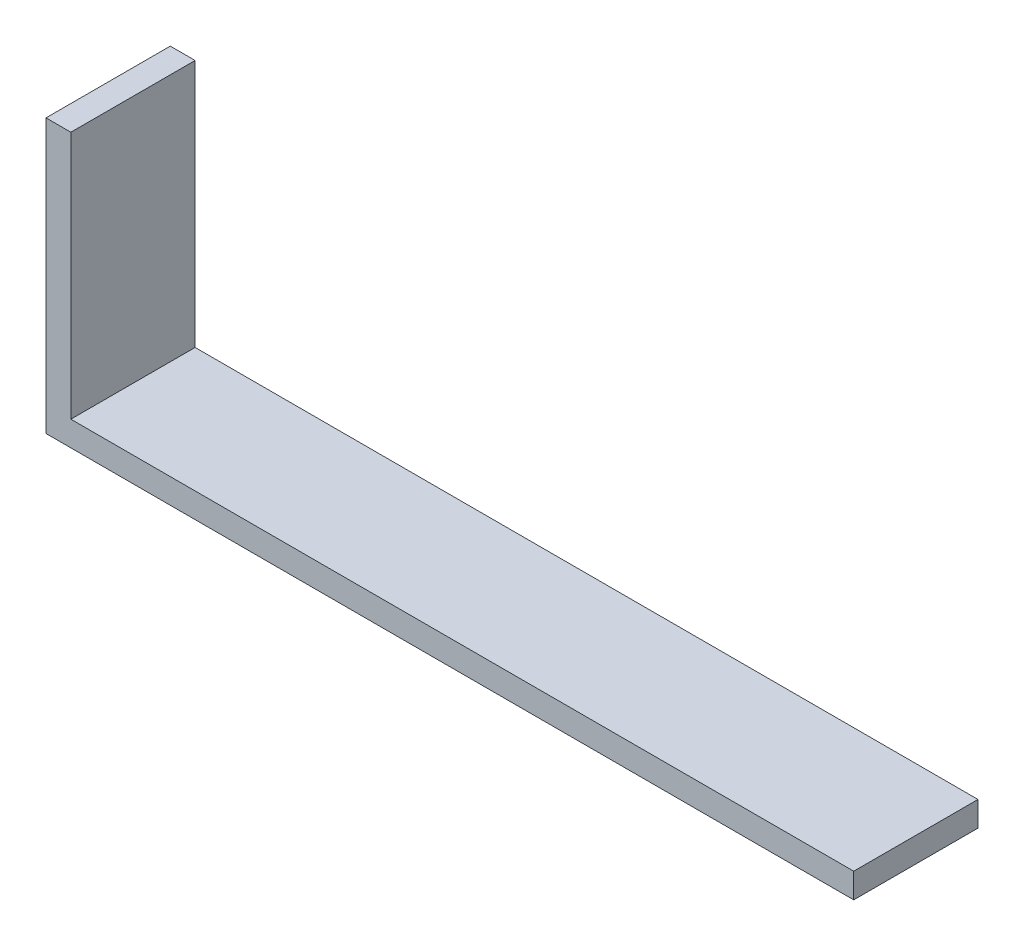
ISO-10303-21;
HEADER;
FILE_DESCRIPTION(('STEP AP214'),'2;1');
FILE_NAME('part.step','',(''),(''),'','','');
FILE_SCHEMA(('AUTOMOTIVE_DESIGN { 1 0 10303 214 1 1 1 1 }'));
ENDSEC;
DATA;
#1=APPLICATION_CONTEXT('core data for automotive mechanical design processes');
#2=APPLICATION_PROTOCOL_DEFINITION('international standard','automotive_design',2000,#1);
#3=PRODUCT_CONTEXT('',#1,'mechanical');
#4=PRODUCT('Part','Part','',(#3));
#5=PRODUCT_RELATED_PRODUCT_CATEGORY('part','',(#4));
#6=PRODUCT_DEFINITION_FORMATION('','',#4);
#7=PRODUCT_DEFINITION_CONTEXT('part definition',#1,'design');
#8=PRODUCT_DEFINITION('design','',#6,#7);
#9=PRODUCT_DEFINITION_SHAPE('','',#8);
#10=(LENGTH_UNIT() NAMED_UNIT(*) SI_UNIT(.MILLI.,.METRE.));
#11=(NAMED_UNIT(*) PLANE_ANGLE_UNIT() SI_UNIT($,.RADIAN.));
#12=(NAMED_UNIT(*) SI_UNIT($,.STERADIAN.) SOLID_ANGLE_UNIT());
#13=UNCERTAINTY_MEASURE_WITH_UNIT(LENGTH_MEASURE(1.E-05),#10,'distance_accuracy_value','');
#14=(GEOMETRIC_REPRESENTATION_CONTEXT(3) GLOBAL_UNCERTAINTY_ASSIGNED_CONTEXT((#13)) GLOBAL_UNIT_ASSIGNED_CONTEXT((#10,
#11,#12)) REPRESENTATION_CONTEXT('',''));
#15=CARTESIAN_POINT('',(0.,0.,0.));
#16=DIRECTION('',(0.,0.,1.));
#17=DIRECTION('',(1.,0.,0.));
#18=AXIS2_PLACEMENT_3D('',#15,#16,#17);
#19=CARTESIAN_POINT('',(1.27,5.98129032258065,6.35));
#20=DIRECTION('',(0.,-1.,0.));
#21=DIRECTION('',(0.,0.,-1.));
#22=AXIS2_PLACEMENT_3D('',#19,#20,#21);
#23=PLANE('',#22);
#24=DIRECTION('',(-1.,0.,0.));
#25=VECTOR('',#24,1.);
#26=CARTESIAN_POINT('',(1.27,5.98129032258065,0.));
#27=LINE('',#26,#25);
#28=CARTESIAN_POINT('',(1.27,5.98129032258065,0.));
#29=VERTEX_POINT('',#28);
#30=CARTESIAN_POINT('',(0.,5.98129032258065,0.));
#31=VERTEX_POINT('',#30);
#32=EDGE_CURVE('E117',#29,#31,#27,.T.);
#33=ORIENTED_EDGE('',*,*,#32,.T.);
#34=DIRECTION('',(0.,0.,-1.));
#35=VECTOR('',#34,1.);
#36=CARTESIAN_POINT('',(0.,5.98129032258065,6.35));
#37=LINE('',#36,#35);
#38=CARTESIAN_POINT('',(0.,5.98129032258065,6.35));
#39=VERTEX_POINT('',#38);
#40=EDGE_CURVE('E11',#39,#31,#37,.T.);
#41=ORIENTED_EDGE('',*,*,#40,.F.);
#42=DIRECTION('',(-1.,0.,0.));
#43=VECTOR('',#42,1.);
#44=CARTESIAN_POINT('',(1.27,5.98129032258065,6.35));
#45=LINE('',#44,#43);
#46=CARTESIAN_POINT('',(1.27,5.98129032258065,6.35));
#47=VERTEX_POINT('',#46);
#48=EDGE_CURVE('E127',#47,#39,#45,.T.);
#49=ORIENTED_EDGE('',*,*,#48,.F.);
#50=DIRECTION('',(0.,0.,-1.));
#51=VECTOR('',#50,1.);
#52=CARTESIAN_POINT('',(1.27,5.98129032258065,6.35));
#53=LINE('',#52,#51);
#54=EDGE_CURVE('E113',#47,#29,#53,.T.);
#55=ORIENTED_EDGE('',*,*,#54,.T.);
#56=EDGE_LOOP('',(#33,#41,#49,#55));
#57=FACE_BOUND('',#56,.T.);
#58=ADVANCED_FACE('F33',(#57),#23,.F.);
#59=CARTESIAN_POINT('',(0.,5.98129032258065,6.35));
#60=DIRECTION('',(1.,0.,0.));
#61=DIRECTION('',(0.,1.,0.));
#62=AXIS2_PLACEMENT_3D('',#59,#60,#61);
#63=PLANE('',#62);
#64=DIRECTION('',(0.,-1.,0.));
#65=VECTOR('',#64,1.);
#66=CARTESIAN_POINT('',(0.,5.98129032258065,0.));
#67=LINE('',#66,#65);
#68=CARTESIAN_POINT('',(0.,-7.98870967741935,0.));
#69=VERTEX_POINT('',#68);
#70=EDGE_CURVE('E120',#31,#69,#67,.T.);
#71=ORIENTED_EDGE('',*,*,#70,.T.);
#72=DIRECTION('',(0.,0.,-1.));
#73=VECTOR('',#72,1.);
#74=CARTESIAN_POINT('',(0.,-7.98870967741935,6.35));
#75=LINE('',#74,#73);
#76=CARTESIAN_POINT('',(0.,-7.98870967741935,6.35));
#77=VERTEX_POINT('',#76);
#78=EDGE_CURVE('E41',#77,#69,#75,.T.);
#79=ORIENTED_EDGE('',*,*,#78,.F.);
#80=DIRECTION('',(0.,-1.,0.));
#81=VECTOR('',#80,1.);
#82=CARTESIAN_POINT('',(0.,5.98129032258065,6.35));
#83=LINE('',#82,#81);
#84=EDGE_CURVE('E86',#39,#77,#83,.T.);
#85=ORIENTED_EDGE('',*,*,#84,.F.);
#86=ORIENTED_EDGE('',*,*,#40,.T.);
#87=EDGE_LOOP('',(#71,#79,#85,#86));
#88=FACE_BOUND('',#87,.T.);
#89=ADVANCED_FACE('F151',(#88),#63,.F.);
#90=CARTESIAN_POINT('',(0.,-7.98870967741935,6.35));
#91=DIRECTION('',(0.,1.,0.));
#92=DIRECTION('',(-1.,0.,0.));
#93=AXIS2_PLACEMENT_3D('',#90,#91,#92);
#94=PLANE('',#93);
#95=DIRECTION('',(1.,0.,0.));
#96=VECTOR('',#95,1.);
#97=CARTESIAN_POINT('',(0.,-7.98870967741935,0.));
#98=LINE('',#97,#96);
#99=CARTESIAN_POINT('',(41.275,-7.98870967741934,0.));
#100=VERTEX_POINT('',#99);
#101=EDGE_CURVE('E122',#69,#100,#98,.T.);
#102=ORIENTED_EDGE('',*,*,#101,.T.);
#103=DIRECTION('',(0.,0.,-1.));
#104=VECTOR('',#103,1.);
#105=CARTESIAN_POINT('',(41.275,-7.98870967741934,6.35));
#106=LINE('',#105,#104);
#107=CARTESIAN_POINT('',(41.275,-7.98870967741934,6.35));
#108=VERTEX_POINT('',#107);
#109=EDGE_CURVE('E108',#108,#100,#106,.T.);
#110=ORIENTED_EDGE('',*,*,#109,.F.);
#111=DIRECTION('',(1.,0.,0.));
#112=VECTOR('',#111,1.);
#113=CARTESIAN_POINT('',(0.,-7.98870967741935,6.35));
#114=LINE('',#113,#112);
#115=EDGE_CURVE('E99',#77,#108,#114,.T.);
#116=ORIENTED_EDGE('',*,*,#115,.F.);
#117=ORIENTED_EDGE('',*,*,#78,.T.);
#118=EDGE_LOOP('',(#102,#110,#116,#117));
#119=FACE_BOUND('',#118,.T.);
#120=ADVANCED_FACE('F133',(#119),#94,.F.);
#121=CARTESIAN_POINT('',(41.275,-7.98870967741934,6.35));
#122=DIRECTION('',(-1.,0.,0.));
#123=DIRECTION('',(0.,0.,1.));
#124=AXIS2_PLACEMENT_3D('',#121,#122,#123);
#125=PLANE('',#124);
#126=DIRECTION('',(0.,1.,0.));
#127=VECTOR('',#126,1.);
#128=CARTESIAN_POINT('',(41.275,-7.98870967741934,0.));
#129=LINE('',#128,#127);
#130=CARTESIAN_POINT('',(41.275,-6.71870967741934,0.));
#131=VERTEX_POINT('',#130);
#132=EDGE_CURVE('E107',#100,#131,#129,.T.);
#133=ORIENTED_EDGE('',*,*,#132,.T.);
#134=DIRECTION('',(0.,0.,-1.));
#135=VECTOR('',#134,1.);
#136=CARTESIAN_POINT('',(41.275,-6.71870967741934,6.35));
#137=LINE('',#136,#135);
#138=CARTESIAN_POINT('',(41.275,-6.71870967741934,6.35));
#139=VERTEX_POINT('',#138);
#140=EDGE_CURVE('E104',#139,#131,#137,.T.);
#141=ORIENTED_EDGE('',*,*,#140,.F.);
#142=DIRECTION('',(0.,1.,0.));
#143=VECTOR('',#142,1.);
#144=CARTESIAN_POINT('',(41.275,-7.98870967741934,6.35));
#145=LINE('',#144,#143);
#146=EDGE_CURVE('E93',#108,#139,#145,.T.);
#147=ORIENTED_EDGE('',*,*,#146,.F.);
#148=ORIENTED_EDGE('',*,*,#109,.T.);
#149=EDGE_LOOP('',(#133,#141,#147,#148));
#150=FACE_BOUND('',#149,.T.);
#151=ADVANCED_FACE('F105',(#150),#125,.F.);
#152=CARTESIAN_POINT('',(41.275,-6.71870967741934,6.35));
#153=DIRECTION('',(0.,-1.,0.));
#154=DIRECTION('',(1.,0.,0.));
#155=AXIS2_PLACEMENT_3D('',#152,#153,#154);
#156=PLANE('',#155);
#157=DIRECTION('',(-1.,0.,0.));
#158=VECTOR('',#157,1.);
#159=CARTESIAN_POINT('',(41.275,-6.71870967741934,0.));
#160=LINE('',#159,#158);
#161=CARTESIAN_POINT('',(1.27,-6.71870967741935,0.));
#162=VERTEX_POINT('',#161);
#163=EDGE_CURVE('E72',#131,#162,#160,.T.);
#164=ORIENTED_EDGE('',*,*,#163,.T.);
#165=DIRECTION('',(0.,0.,-1.));
#166=VECTOR('',#165,1.);
#167=CARTESIAN_POINT('',(1.27,-6.71870967741935,6.35));
#168=LINE('',#167,#166);
#169=CARTESIAN_POINT('',(1.27,-6.71870967741935,6.35));
#170=VERTEX_POINT('',#169);
#171=EDGE_CURVE('E109',#170,#162,#168,.T.);
#172=ORIENTED_EDGE('',*,*,#171,.F.);
#173=DIRECTION('',(-1.,0.,0.));
#174=VECTOR('',#173,1.);
#175=CARTESIAN_POINT('',(41.275,-6.71870967741934,6.35));
#176=LINE('',#175,#174);
#177=EDGE_CURVE('E97',#139,#170,#176,.T.);
#178=ORIENTED_EDGE('',*,*,#177,.F.);
#179=ORIENTED_EDGE('',*,*,#140,.T.);
#180=EDGE_LOOP('',(#164,#172,#178,#179));
#181=FACE_BOUND('',#180,.T.);
#182=ADVANCED_FACE('F111',(#181),#156,.F.);
#183=CARTESIAN_POINT('',(1.27,-6.71870967741935,6.35));
#184=DIRECTION('',(-1.,0.,0.));
#185=DIRECTION('',(0.,-1.,0.));
#186=AXIS2_PLACEMENT_3D('',#183,#184,#185);
#187=PLANE('',#186);
#188=DIRECTION('',(0.,1.,0.));
#189=VECTOR('',#188,1.);
#190=CARTESIAN_POINT('',(1.27,-6.71870967741935,0.));
#191=LINE('',#190,#189);
#192=EDGE_CURVE('E78',#162,#29,#191,.T.);
#193=ORIENTED_EDGE('',*,*,#192,.T.);
#194=ORIENTED_EDGE('',*,*,#54,.F.);
#195=DIRECTION('',(0.,1.,0.));
#196=VECTOR('',#195,1.);
#197=CARTESIAN_POINT('',(1.27,-6.71870967741935,6.35));
#198=LINE('',#197,#196);
#199=EDGE_CURVE('E49',#170,#47,#198,.T.);
#200=ORIENTED_EDGE('',*,*,#199,.F.);
#201=ORIENTED_EDGE('',*,*,#171,.T.);
#202=EDGE_LOOP('',(#193,#194,#200,#201));
#203=FACE_BOUND('',#202,.T.);
#204=ADVANCED_FACE('F140',(#203),#187,.F.);
#205=CARTESIAN_POINT('',(0.,0.,6.35));
#206=DIRECTION('',(0.,0.,1.));
#207=DIRECTION('',(1.,0.,0.));
#208=AXIS2_PLACEMENT_3D('',#205,#206,#207);
#209=PLANE('',#208);
#210=ORIENTED_EDGE('',*,*,#48,.T.);
#211=ORIENTED_EDGE('',*,*,#84,.T.);
#212=ORIENTED_EDGE('',*,*,#115,.T.);
#213=ORIENTED_EDGE('',*,*,#146,.T.);
#214=ORIENTED_EDGE('',*,*,#177,.T.);
#215=ORIENTED_EDGE('',*,*,#199,.T.);
#216=EDGE_LOOP('',(#210,#211,#212,#213,#214,#215));
#217=FACE_BOUND('',#216,.T.);
#218=ADVANCED_FACE('F95',(#217),#209,.T.);
#219=CARTESIAN_POINT('',(0.,0.,0.));
#220=DIRECTION('',(0.,0.,1.));
#221=DIRECTION('',(1.,0.,0.));
#222=AXIS2_PLACEMENT_3D('',#219,#220,#221);
#223=PLANE('',#222);
#224=ORIENTED_EDGE('',*,*,#32,.F.);
#225=ORIENTED_EDGE('',*,*,#192,.F.);
#226=ORIENTED_EDGE('',*,*,#163,.F.);
#227=ORIENTED_EDGE('',*,*,#132,.F.);
#228=ORIENTED_EDGE('',*,*,#101,.F.);
#229=ORIENTED_EDGE('',*,*,#70,.F.);
#230=EDGE_LOOP('',(#224,#225,#226,#227,#228,#229));
#231=FACE_BOUND('',#230,.T.);
#232=ADVANCED_FACE('F136',(#231),#223,.F.);
#233=CLOSED_SHELL('',(#58,#89,#120,#151,#182,#204,#218,#232));
#234=MANIFOLD_SOLID_BREP('B2',#233);
#235=ADVANCED_BREP_SHAPE_REPRESENTATION('',(#18,#234),#14);
#236=SHAPE_DEFINITION_REPRESENTATION(#9,#235);
ENDSEC;
END-ISO-10303-21;
